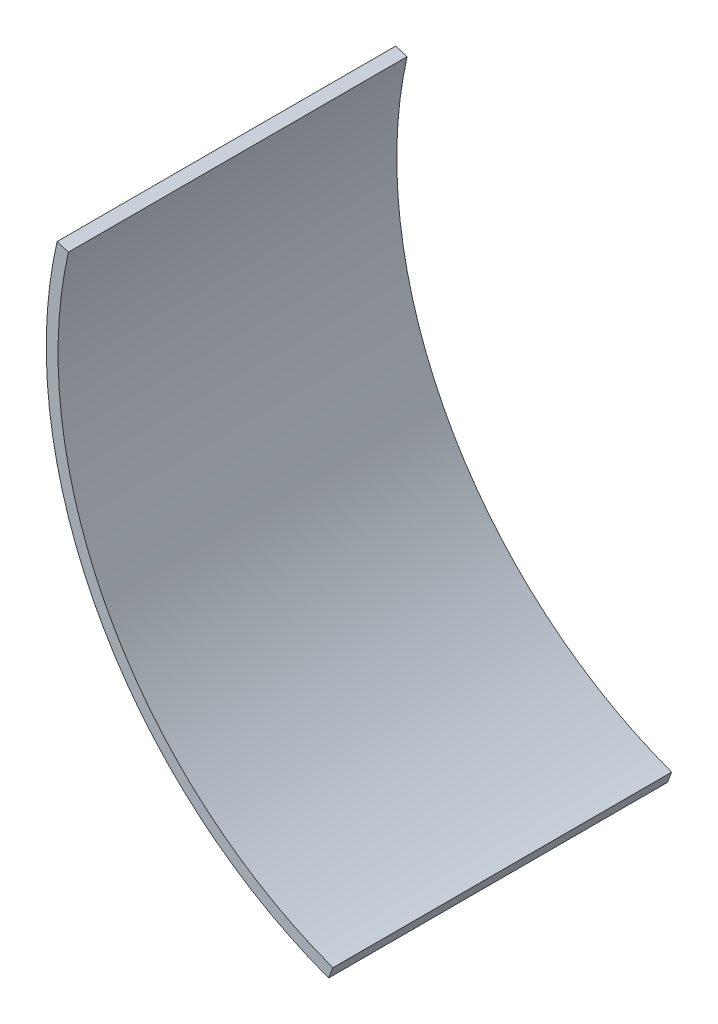
ISO-10303-21;
HEADER;
FILE_DESCRIPTION(('STEP AP214'),'2;1');
FILE_NAME('part.step','',(''),(''),'','','');
FILE_SCHEMA(('AUTOMOTIVE_DESIGN { 1 0 10303 214 1 1 1 1 }'));
ENDSEC;
DATA;
#1=APPLICATION_CONTEXT('core data for automotive mechanical design processes');
#2=APPLICATION_PROTOCOL_DEFINITION('international standard','automotive_design',2000,#1);
#3=PRODUCT_CONTEXT('',#1,'mechanical');
#4=PRODUCT('Part','Part','',(#3));
#5=PRODUCT_RELATED_PRODUCT_CATEGORY('part','',(#4));
#6=PRODUCT_DEFINITION_FORMATION('','',#4);
#7=PRODUCT_DEFINITION_CONTEXT('part definition',#1,'design');
#8=PRODUCT_DEFINITION('design','',#6,#7);
#9=PRODUCT_DEFINITION_SHAPE('','',#8);
#10=(LENGTH_UNIT() NAMED_UNIT(*) SI_UNIT(.MILLI.,.METRE.));
#11=(NAMED_UNIT(*) PLANE_ANGLE_UNIT() SI_UNIT($,.RADIAN.));
#12=(NAMED_UNIT(*) SI_UNIT($,.STERADIAN.) SOLID_ANGLE_UNIT());
#13=UNCERTAINTY_MEASURE_WITH_UNIT(LENGTH_MEASURE(1.E-05),#10,'distance_accuracy_value','');
#14=(GEOMETRIC_REPRESENTATION_CONTEXT(3) GLOBAL_UNCERTAINTY_ASSIGNED_CONTEXT((#13)) GLOBAL_UNIT_ASSIGNED_CONTEXT((#10,
#11,#12)) REPRESENTATION_CONTEXT('',''));
#15=CARTESIAN_POINT('',(0.,0.,0.));
#16=DIRECTION('',(0.,0.,1.));
#17=DIRECTION('',(1.,0.,0.));
#18=AXIS2_PLACEMENT_3D('',#15,#16,#17);
#19=CARTESIAN_POINT('',(3243.45082456271,1808.28370384598,430.));
#20=DIRECTION('',(0.,0.,-1.));
#21=DIRECTION('',(-1.,0.,0.));
#22=AXIS2_PLACEMENT_3D('',#19,#20,#21);
#23=CYLINDRICAL_SURFACE('',#22,534.387659983748);
#24=CARTESIAN_POINT('',(3243.45082456271,1808.28370384598,0.));
#25=DIRECTION('',(0.,0.,1.));
#26=DIRECTION('',(1.,0.,0.));
#27=AXIS2_PLACEMENT_3D('',#24,#25,#26);
#28=CIRCLE('',#27,534.387659983748);
#29=CARTESIAN_POINT('',(2722.16389424815,1925.88518098862,0.));
#30=VERTEX_POINT('',#29);
#31=CARTESIAN_POINT('',(3057.99719968873,1307.10796205074,0.));
#32=VERTEX_POINT('',#31);
#33=EDGE_CURVE('E79',#30,#32,#28,.T.);
#34=ORIENTED_EDGE('',*,*,#33,.F.);
#35=DIRECTION('',(0.,0.,-1.));
#36=VECTOR('',#35,1.);
#37=CARTESIAN_POINT('',(2722.16389424815,1925.88518098862,430.));
#38=LINE('',#37,#36);
#39=CARTESIAN_POINT('',(2722.16389424815,1925.88518098862,430.));
#40=VERTEX_POINT('',#39);
#41=EDGE_CURVE('E10',#40,#30,#38,.T.);
#42=ORIENTED_EDGE('',*,*,#41,.F.);
#43=CARTESIAN_POINT('',(3243.45082456271,1808.28370384598,430.));
#44=DIRECTION('',(0.,0.,1.));
#45=DIRECTION('',(1.,0.,0.));
#46=AXIS2_PLACEMENT_3D('',#43,#44,#45);
#47=CIRCLE('',#46,534.387659983748);
#48=CARTESIAN_POINT('',(3057.99719968873,1307.10796205074,430.));
#49=VERTEX_POINT('',#48);
#50=EDGE_CURVE('E73',#40,#49,#47,.T.);
#51=ORIENTED_EDGE('',*,*,#50,.T.);
#52=DIRECTION('',(0.,0.,-1.));
#53=VECTOR('',#52,1.);
#54=CARTESIAN_POINT('',(3057.99719968873,1307.10796205074,430.));
#55=LINE('',#54,#53);
#56=EDGE_CURVE('E54',#49,#32,#55,.T.);
#57=ORIENTED_EDGE('',*,*,#56,.T.);
#58=EDGE_LOOP('',(#34,#42,#51,#57));
#59=FACE_BOUND('',#58,.T.);
#60=ADVANCED_FACE('F16',(#59),#23,.F.);
#61=CARTESIAN_POINT('',(798.951636533948,2532.59605966857,430.));
#62=DIRECTION('',(0.300852104091896,0.953670808750839,0.));
#63=DIRECTION('',(-0.953670808750839,0.300852104091896,0.));
#64=AXIS2_PLACEMENT_3D('',#61,#62,#63);
#65=PLANE('',#64);
#66=DIRECTION('',(0.953670808750839,-0.300852104091896,0.));
#67=VECTOR('',#66,1.);
#68=CARTESIAN_POINT('',(798.951636533948,2532.59605966857,0.));
#69=LINE('',#68,#67);
#70=CARTESIAN_POINT('',(2707.80995361861,1930.41338212551,0.));
#71=VERTEX_POINT('',#70);
#72=EDGE_CURVE('E67',#71,#30,#69,.T.);
#73=ORIENTED_EDGE('',*,*,#72,.F.);
#74=DIRECTION('',(0.,0.,-1.));
#75=VECTOR('',#74,1.);
#76=CARTESIAN_POINT('',(2707.80995361861,1930.41338212551,430.));
#77=LINE('',#76,#75);
#78=CARTESIAN_POINT('',(2707.80995361861,1930.41338212551,430.));
#79=VERTEX_POINT('',#78);
#80=EDGE_CURVE('E24',#79,#71,#77,.T.);
#81=ORIENTED_EDGE('',*,*,#80,.F.);
#82=DIRECTION('',(0.953670808750839,-0.300852104091896,0.));
#83=VECTOR('',#82,1.);
#84=CARTESIAN_POINT('',(798.951636533948,2532.59605966857,430.));
#85=LINE('',#84,#83);
#86=EDGE_CURVE('E65',#79,#40,#85,.T.);
#87=ORIENTED_EDGE('',*,*,#86,.T.);
#88=ORIENTED_EDGE('',*,*,#41,.T.);
#89=EDGE_LOOP('',(#73,#81,#87,#88));
#90=FACE_BOUND('',#89,.T.);
#91=ADVANCED_FACE('F63',(#90),#65,.T.);
#92=CARTESIAN_POINT('',(3243.45082456271,1808.28370384598,430.));
#93=DIRECTION('',(0.,0.,-1.));
#94=DIRECTION('',(-1.,0.,0.));
#95=AXIS2_PLACEMENT_3D('',#92,#93,#94);
#96=CYLINDRICAL_SURFACE('',#95,549.387659983748);
#97=CARTESIAN_POINT('',(3243.45082456271,1808.28370384598,0.));
#98=DIRECTION('',(0.,0.,1.));
#99=DIRECTION('',(1.,0.,0.));
#100=AXIS2_PLACEMENT_3D('',#97,#98,#99);
#101=CIRCLE('',#100,549.387659983748);
#102=CARTESIAN_POINT('',(3052.55928390283,1293.12623214736,0.));
#103=VERTEX_POINT('',#102);
#104=EDGE_CURVE('E47',#71,#103,#101,.T.);
#105=ORIENTED_EDGE('',*,*,#104,.T.);
#106=DIRECTION('',(0.,0.,-1.));
#107=VECTOR('',#106,1.);
#108=CARTESIAN_POINT('',(3052.55928390283,1293.12623214736,430.));
#109=LINE('',#108,#107);
#110=CARTESIAN_POINT('',(3052.55928390283,1293.12623214736,430.));
#111=VERTEX_POINT('',#110);
#112=EDGE_CURVE('E68',#111,#103,#109,.T.);
#113=ORIENTED_EDGE('',*,*,#112,.F.);
#114=CARTESIAN_POINT('',(3243.45082456271,1808.28370384598,430.));
#115=DIRECTION('',(0.,0.,1.));
#116=DIRECTION('',(1.,0.,0.));
#117=AXIS2_PLACEMENT_3D('',#114,#115,#116);
#118=CIRCLE('',#117,549.387659983748);
#119=EDGE_CURVE('E69',#79,#111,#118,.T.);
#120=ORIENTED_EDGE('',*,*,#119,.F.);
#121=ORIENTED_EDGE('',*,*,#80,.T.);
#122=EDGE_LOOP('',(#105,#113,#120,#121));
#123=FACE_BOUND('',#122,.T.);
#124=ADVANCED_FACE('F70',(#123),#96,.T.);
#125=CARTESIAN_POINT('',(2214.62472795747,-861.334244847671,430.));
#126=DIRECTION('',(-0.931991692548014,0.362479633940294,0.));
#127=DIRECTION('',(-0.362479633940294,-0.931991692548014,0.));
#128=AXIS2_PLACEMENT_3D('',#125,#126,#127);
#129=PLANE('',#128);
#130=DIRECTION('',(0.362479633940294,0.931991692548014,0.));
#131=VECTOR('',#130,1.);
#132=CARTESIAN_POINT('',(2214.62472795747,-861.334244847671,0.));
#133=LINE('',#132,#131);
#134=EDGE_CURVE('E75',#103,#32,#133,.T.);
#135=ORIENTED_EDGE('',*,*,#134,.T.);
#136=ORIENTED_EDGE('',*,*,#56,.F.);
#137=DIRECTION('',(0.362479633940294,0.931991692548014,0.));
#138=VECTOR('',#137,1.);
#139=CARTESIAN_POINT('',(2214.62472795747,-861.334244847671,430.));
#140=LINE('',#139,#138);
#141=EDGE_CURVE('E32',#111,#49,#140,.T.);
#142=ORIENTED_EDGE('',*,*,#141,.F.);
#143=ORIENTED_EDGE('',*,*,#112,.T.);
#144=EDGE_LOOP('',(#135,#136,#142,#143));
#145=FACE_BOUND('',#144,.T.);
#146=ADVANCED_FACE('F88',(#145),#129,.F.);
#147=CARTESIAN_POINT('',(0.,0.,430.));
#148=DIRECTION('',(0.,0.,1.));
#149=DIRECTION('',(1.,0.,0.));
#150=AXIS2_PLACEMENT_3D('',#147,#148,#149);
#151=PLANE('',#150);
#152=ORIENTED_EDGE('',*,*,#50,.F.);
#153=ORIENTED_EDGE('',*,*,#86,.F.);
#154=ORIENTED_EDGE('',*,*,#119,.T.);
#155=ORIENTED_EDGE('',*,*,#141,.T.);
#156=EDGE_LOOP('',(#152,#153,#154,#155));
#157=FACE_BOUND('',#156,.T.);
#158=ADVANCED_FACE('F72',(#157),#151,.T.);
#159=CARTESIAN_POINT('',(0.,0.,0.));
#160=DIRECTION('',(0.,0.,1.));
#161=DIRECTION('',(1.,0.,0.));
#162=AXIS2_PLACEMENT_3D('',#159,#160,#161);
#163=PLANE('',#162);
#164=ORIENTED_EDGE('',*,*,#33,.T.);
#165=ORIENTED_EDGE('',*,*,#134,.F.);
#166=ORIENTED_EDGE('',*,*,#104,.F.);
#167=ORIENTED_EDGE('',*,*,#72,.T.);
#168=EDGE_LOOP('',(#164,#165,#166,#167));
#169=FACE_BOUND('',#168,.T.);
#170=ADVANCED_FACE('F90',(#169),#163,.F.);
#171=CLOSED_SHELL('',(#60,#91,#124,#146,#158,#170));
#172=MANIFOLD_SOLID_BREP('B1',#171);
#173=ADVANCED_BREP_SHAPE_REPRESENTATION('',(#18,#172),#14);
#174=SHAPE_DEFINITION_REPRESENTATION(#9,#173);
ENDSEC;
END-ISO-10303-21;
